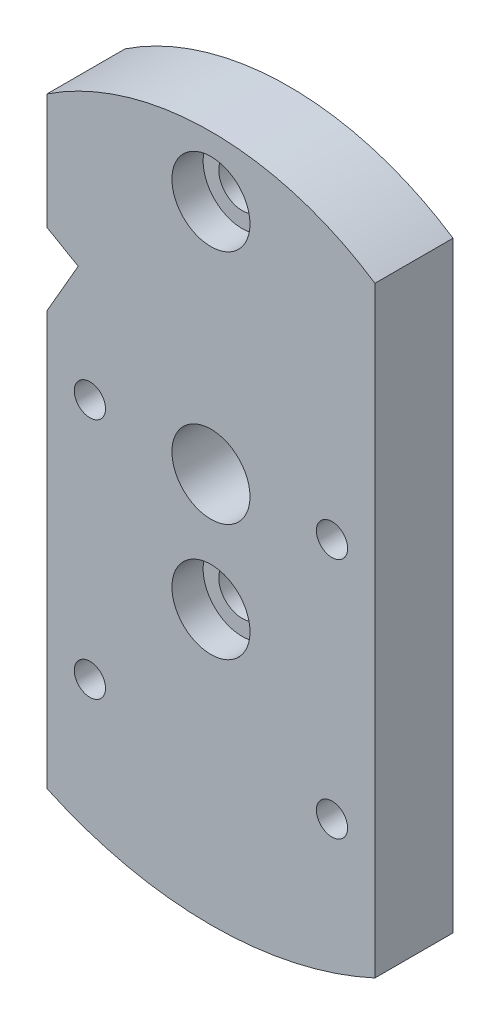
ISO-10303-21;
HEADER;
FILE_DESCRIPTION(('STEP AP214'),'2;1');
FILE_NAME('part.step','',(''),(''),'','','');
FILE_SCHEMA(('AUTOMOTIVE_DESIGN { 1 0 10303 214 1 1 1 1 }'));
ENDSEC;
DATA;
#1=APPLICATION_CONTEXT('core data for automotive mechanical design processes');
#2=APPLICATION_PROTOCOL_DEFINITION('international standard','automotive_design',2000,#1);
#3=PRODUCT_CONTEXT('',#1,'mechanical');
#4=PRODUCT('Part','Part','',(#3));
#5=PRODUCT_RELATED_PRODUCT_CATEGORY('part','',(#4));
#6=PRODUCT_DEFINITION_FORMATION('','',#4);
#7=PRODUCT_DEFINITION_CONTEXT('part definition',#1,'design');
#8=PRODUCT_DEFINITION('design','',#6,#7);
#9=PRODUCT_DEFINITION_SHAPE('','',#8);
#10=(LENGTH_UNIT() NAMED_UNIT(*) SI_UNIT(.MILLI.,.METRE.));
#11=(NAMED_UNIT(*) PLANE_ANGLE_UNIT() SI_UNIT($,.RADIAN.));
#12=(NAMED_UNIT(*) SI_UNIT($,.STERADIAN.) SOLID_ANGLE_UNIT());
#13=UNCERTAINTY_MEASURE_WITH_UNIT(LENGTH_MEASURE(1.E-05),#10,'distance_accuracy_value','');
#14=(GEOMETRIC_REPRESENTATION_CONTEXT(3) GLOBAL_UNCERTAINTY_ASSIGNED_CONTEXT((#13)) GLOBAL_UNIT_ASSIGNED_CONTEXT((#10,
#11,#12)) REPRESENTATION_CONTEXT('',''));
#15=CARTESIAN_POINT('',(0.,0.,0.));
#16=DIRECTION('',(0.,0.,1.));
#17=DIRECTION('',(1.,0.,0.));
#18=AXIS2_PLACEMENT_3D('',#15,#16,#17);
#19=CARTESIAN_POINT('',(-28.1737576182718,-2.22608611624981,0.));
#20=DIRECTION('',(0.866025403784438,-0.500000000000001,0.));
#21=DIRECTION('',(0.500000000000001,0.866025403784438,0.));
#22=AXIS2_PLACEMENT_3D('',#19,#20,#21);
#23=PLANE('',#22);
#24=DIRECTION('',(0.500000000000001,0.866025403784438,0.));
#25=VECTOR('',#24,1.);
#26=CARTESIAN_POINT('',(-28.1737576182718,-2.22608611624981,10.));
#27=LINE('',#26,#25);
#28=CARTESIAN_POINT('',(-28.1737576182718,-2.22608611624981,10.));
#29=VERTEX_POINT('',#28);
#30=CARTESIAN_POINT('',(-24.1737576182718,4.7021171140257,10.));
#31=VERTEX_POINT('',#30);
#32=EDGE_CURVE('E116',#29,#31,#27,.T.);
#33=ORIENTED_EDGE('',*,*,#32,.T.);
#34=DIRECTION('',(0.,0.,1.));
#35=VECTOR('',#34,1.);
#36=CARTESIAN_POINT('',(-24.1737576182718,4.7021171140257,0.));
#37=LINE('',#36,#35);
#38=CARTESIAN_POINT('',(-24.1737576182718,4.7021171140257,0.));
#39=VERTEX_POINT('',#38);
#40=EDGE_CURVE('E112',#39,#31,#37,.T.);
#41=ORIENTED_EDGE('',*,*,#40,.F.);
#42=DIRECTION('',(0.500000000000001,0.866025403784438,0.));
#43=VECTOR('',#42,1.);
#44=CARTESIAN_POINT('',(-28.1737576182718,-2.22608611624981,0.));
#45=LINE('',#44,#43);
#46=CARTESIAN_POINT('',(-28.1737576182717,-2.2260861162498,0.));
#47=VERTEX_POINT('',#46);
#48=EDGE_CURVE('E62',#47,#39,#45,.T.);
#49=ORIENTED_EDGE('',*,*,#48,.F.);
#50=DIRECTION('',(0.,0.,1.));
#51=VECTOR('',#50,1.);
#52=CARTESIAN_POINT('',(-28.1737576182718,-2.22608611624981,0.));
#53=LINE('',#52,#51);
#54=EDGE_CURVE('E120',#47,#29,#53,.T.);
#55=ORIENTED_EDGE('',*,*,#54,.T.);
#56=EDGE_LOOP('',(#33,#41,#49,#55));
#57=FACE_BOUND('',#56,.T.);
#58=CARTESIAN_POINT('',(-26.1737576182718,1.23801549888795,5.));
#59=DIRECTION('',(-0.866025403784438,0.500000000000001,0.));
#60=DIRECTION('',(-0.500000000000001,-0.866025403784438,0.));
#61=AXIS2_PLACEMENT_3D('',#58,#59,#60);
#62=CIRCLE('',#61,2.025);
#63=CARTESIAN_POINT('',(-27.1862576182718,-0.515685943775535,5.));
#64=VERTEX_POINT('',#63);
#65=EDGE_CURVE('E436',#64,#64,#62,.T.);
#66=ORIENTED_EDGE('',*,*,#65,.F.);
#67=EDGE_LOOP('',(#66));
#68=FACE_BOUND('',#67,.T.);
#69=ADVANCED_FACE('F40',(#57,#68),#23,.F.);
#70=CARTESIAN_POINT('',(-28.1737576182717,-45.8530191573034,10.));
#71=DIRECTION('',(1.,0.,0.));
#72=DIRECTION('',(0.,0.,-1.));
#73=AXIS2_PLACEMENT_3D('',#70,#71,#72);
#74=PLANE('',#73);
#75=DIRECTION('',(0.,-1.,0.));
#76=VECTOR('',#75,1.);
#77=CARTESIAN_POINT('',(-28.1737576182717,-45.8530191573034,0.));
#78=LINE('',#77,#76);
#79=CARTESIAN_POINT('',(-28.1737576182718,21.8171560869228,0.));
#80=VERTEX_POINT('',#79);
#81=CARTESIAN_POINT('',(-28.1737576182718,7.01151819078422,0.));
#82=VERTEX_POINT('',#81);
#83=EDGE_CURVE('E220',#80,#82,#78,.T.);
#84=ORIENTED_EDGE('',*,*,#83,.T.);
#85=DIRECTION('',(0.,0.,1.));
#86=VECTOR('',#85,1.);
#87=CARTESIAN_POINT('',(-28.1737576182718,7.01151819078422,0.));
#88=LINE('',#87,#86);
#89=CARTESIAN_POINT('',(-28.1737576182718,7.01151819078422,10.));
#90=VERTEX_POINT('',#89);
#91=EDGE_CURVE('E119',#82,#90,#88,.T.);
#92=ORIENTED_EDGE('',*,*,#91,.T.);
#93=DIRECTION('',(0.,-1.,0.));
#94=VECTOR('',#93,1.);
#95=CARTESIAN_POINT('',(-28.1737576182718,21.8171560869228,10.));
#96=LINE('',#95,#94);
#97=CARTESIAN_POINT('',(-28.1737576182718,21.8171560869228,10.));
#98=VERTEX_POINT('',#97);
#99=EDGE_CURVE('E211',#98,#90,#96,.T.);
#100=ORIENTED_EDGE('',*,*,#99,.F.);
#101=DIRECTION('',(0.,0.,-1.));
#102=VECTOR('',#101,1.);
#103=CARTESIAN_POINT('',(-28.1737576182718,21.8171560869228,10.));
#104=LINE('',#103,#102);
#105=EDGE_CURVE('E54',#98,#80,#104,.T.);
#106=ORIENTED_EDGE('',*,*,#105,.T.);
#107=EDGE_LOOP('',(#84,#92,#100,#106));
#108=FACE_BOUND('',#107,.T.);
#109=ADVANCED_FACE('F285',(#108),#74,.F.);
#110=CARTESIAN_POINT('',(-22.6737576182718,-9.35301915730339,10.));
#111=DIRECTION('',(0.,0.,-1.));
#112=DIRECTION('',(-1.,0.,0.));
#113=AXIS2_PLACEMENT_3D('',#110,#111,#112);
#114=CYLINDRICAL_SURFACE('',#113,2.);
#115=CARTESIAN_POINT('',(-22.6737576182718,-9.35301915730339,10.));
#116=DIRECTION('',(0.,0.,1.));
#117=DIRECTION('',(1.,0.,0.));
#118=AXIS2_PLACEMENT_3D('',#115,#116,#117);
#119=CIRCLE('',#118,2.);
#120=CARTESIAN_POINT('',(-20.6737576182718,-9.35301915730339,10.));
#121=VERTEX_POINT('',#120);
#122=EDGE_CURVE('E194',#121,#121,#119,.T.);
#123=ORIENTED_EDGE('',*,*,#122,.T.);
#124=EDGE_LOOP('',(#123));
#125=FACE_BOUND('',#124,.T.);
#126=CARTESIAN_POINT('',(-22.6737576182718,-9.35301915730339,5.));
#127=DIRECTION('',(0.,0.,-1.));
#128=DIRECTION('',(-1.,0.,0.));
#129=AXIS2_PLACEMENT_3D('',#126,#127,#128);
#130=CIRCLE('',#129,2.);
#131=CARTESIAN_POINT('',(-24.6737576182718,-9.35301915730339,5.));
#132=VERTEX_POINT('',#131);
#133=EDGE_CURVE('E180',#132,#132,#130,.T.);
#134=ORIENTED_EDGE('',*,*,#133,.T.);
#135=EDGE_LOOP('',(#134));
#136=FACE_BOUND('',#135,.T.);
#137=ADVANCED_FACE('F244',(#125,#136),#114,.F.);
#138=CARTESIAN_POINT('',(-22.6737576182718,-40.3530191573034,10.));
#139=DIRECTION('',(0.,0.,-1.));
#140=DIRECTION('',(-1.,0.,0.));
#141=AXIS2_PLACEMENT_3D('',#138,#139,#140);
#142=CYLINDRICAL_SURFACE('',#141,2.);
#143=CARTESIAN_POINT('',(-22.6737576182718,-40.3530191573034,10.));
#144=DIRECTION('',(0.,0.,1.));
#145=DIRECTION('',(1.,0.,0.));
#146=AXIS2_PLACEMENT_3D('',#143,#144,#145);
#147=CIRCLE('',#146,2.);
#148=CARTESIAN_POINT('',(-20.6737576182718,-40.3530191573034,10.));
#149=VERTEX_POINT('',#148);
#150=EDGE_CURVE('E191',#149,#149,#147,.T.);
#151=ORIENTED_EDGE('',*,*,#150,.T.);
#152=EDGE_LOOP('',(#151));
#153=FACE_BOUND('',#152,.T.);
#154=CARTESIAN_POINT('',(-22.6737576182718,-40.3530191573034,5.));
#155=DIRECTION('',(0.,0.,-1.));
#156=DIRECTION('',(-1.,0.,0.));
#157=AXIS2_PLACEMENT_3D('',#154,#155,#156);
#158=CIRCLE('',#157,2.);
#159=CARTESIAN_POINT('',(-24.6737576182718,-40.3530191573034,5.));
#160=VERTEX_POINT('',#159);
#161=EDGE_CURVE('E239',#160,#160,#158,.T.);
#162=ORIENTED_EDGE('',*,*,#161,.T.);
#163=EDGE_LOOP('',(#162));
#164=FACE_BOUND('',#163,.T.);
#165=ADVANCED_FACE('F478',(#153,#164),#142,.F.);
#166=CARTESIAN_POINT('',(8.32624238172824,-40.3530191573034,10.));
#167=DIRECTION('',(0.,0.,-1.));
#168=DIRECTION('',(-1.,0.,0.));
#169=AXIS2_PLACEMENT_3D('',#166,#167,#168);
#170=CYLINDRICAL_SURFACE('',#169,2.);
#171=CARTESIAN_POINT('',(8.32624238172824,-40.3530191573034,10.));
#172=DIRECTION('',(0.,0.,1.));
#173=DIRECTION('',(1.,0.,0.));
#174=AXIS2_PLACEMENT_3D('',#171,#172,#173);
#175=CIRCLE('',#174,2.);
#176=CARTESIAN_POINT('',(10.3262423817282,-40.3530191573034,10.));
#177=VERTEX_POINT('',#176);
#178=EDGE_CURVE('E188',#177,#177,#175,.T.);
#179=ORIENTED_EDGE('',*,*,#178,.T.);
#180=EDGE_LOOP('',(#179));
#181=FACE_BOUND('',#180,.T.);
#182=CARTESIAN_POINT('',(8.32624238172824,-40.3530191573034,5.));
#183=DIRECTION('',(0.,0.,-1.));
#184=DIRECTION('',(-1.,0.,0.));
#185=AXIS2_PLACEMENT_3D('',#182,#183,#184);
#186=CIRCLE('',#185,2.);
#187=CARTESIAN_POINT('',(6.32624238172824,-40.3530191573034,5.));
#188=VERTEX_POINT('',#187);
#189=EDGE_CURVE('E236',#188,#188,#186,.T.);
#190=ORIENTED_EDGE('',*,*,#189,.T.);
#191=EDGE_LOOP('',(#190));
#192=FACE_BOUND('',#191,.T.);
#193=ADVANCED_FACE('F474',(#181,#192),#170,.F.);
#194=CARTESIAN_POINT('',(8.32624238172824,-9.35301915730338,10.));
#195=DIRECTION('',(0.,0.,-1.));
#196=DIRECTION('',(-1.,0.,0.));
#197=AXIS2_PLACEMENT_3D('',#194,#195,#196);
#198=CYLINDRICAL_SURFACE('',#197,2.);
#199=CARTESIAN_POINT('',(8.32624238172824,-9.35301915730338,10.));
#200=DIRECTION('',(0.,0.,1.));
#201=DIRECTION('',(1.,0.,0.));
#202=AXIS2_PLACEMENT_3D('',#199,#200,#201);
#203=CIRCLE('',#202,2.);
#204=CARTESIAN_POINT('',(10.3262423817282,-9.35301915730338,10.));
#205=VERTEX_POINT('',#204);
#206=EDGE_CURVE('E184',#205,#205,#203,.T.);
#207=ORIENTED_EDGE('',*,*,#206,.T.);
#208=EDGE_LOOP('',(#207));
#209=FACE_BOUND('',#208,.T.);
#210=CARTESIAN_POINT('',(8.32624238172824,-9.35301915730338,5.));
#211=DIRECTION('',(0.,0.,-1.));
#212=DIRECTION('',(-1.,0.,0.));
#213=AXIS2_PLACEMENT_3D('',#210,#211,#212);
#214=CIRCLE('',#213,2.);
#215=CARTESIAN_POINT('',(6.32624238172824,-9.35301915730338,5.));
#216=VERTEX_POINT('',#215);
#217=EDGE_CURVE('E164',#216,#216,#214,.T.);
#218=ORIENTED_EDGE('',*,*,#217,.T.);
#219=EDGE_LOOP('',(#218));
#220=FACE_BOUND('',#219,.T.);
#221=ADVANCED_FACE('F477',(#209,#220),#198,.F.);
#222=CARTESIAN_POINT('',(-7.17375761827176,-24.8530191573034,10.));
#223=DIRECTION('',(0.,0.,-1.));
#224=DIRECTION('',(-1.,0.,0.));
#225=AXIS2_PLACEMENT_3D('',#222,#223,#224);
#226=CYLINDRICAL_SURFACE('',#225,3.);
#227=CARTESIAN_POINT('',(-7.17375761827176,-24.8530191573034,0.));
#228=DIRECTION('',(0.,0.,1.));
#229=DIRECTION('',(1.,0.,0.));
#230=AXIS2_PLACEMENT_3D('',#227,#228,#229);
#231=CIRCLE('',#230,3.);
#232=CARTESIAN_POINT('',(-4.17375761827176,-24.8530191573034,0.));
#233=VERTEX_POINT('',#232);
#234=EDGE_CURVE('E201',#233,#233,#231,.T.);
#235=ORIENTED_EDGE('',*,*,#234,.F.);
#236=EDGE_LOOP('',(#235));
#237=FACE_BOUND('',#236,.T.);
#238=CARTESIAN_POINT('',(-7.17375761827176,-24.8530191573034,6.));
#239=DIRECTION('',(0.,0.,1.));
#240=DIRECTION('',(1.,0.,0.));
#241=AXIS2_PLACEMENT_3D('',#238,#239,#240);
#242=CIRCLE('',#241,3.);
#243=CARTESIAN_POINT('',(-4.17375761827176,-24.8530191573034,6.));
#244=VERTEX_POINT('',#243);
#245=EDGE_CURVE('E185',#244,#244,#242,.T.);
#246=ORIENTED_EDGE('',*,*,#245,.T.);
#247=EDGE_LOOP('',(#246));
#248=FACE_BOUND('',#247,.T.);
#249=ADVANCED_FACE('F449',(#237,#248),#226,.F.);
#250=CARTESIAN_POINT('',(-7.17375761827176,20.3769808426966,10.));
#251=DIRECTION('',(0.,0.,-1.));
#252=DIRECTION('',(-1.,0.,0.));
#253=AXIS2_PLACEMENT_3D('',#250,#251,#252);
#254=CYLINDRICAL_SURFACE('',#253,3.);
#255=CARTESIAN_POINT('',(-7.17375761827176,20.3769808426966,0.));
#256=DIRECTION('',(0.,0.,1.));
#257=DIRECTION('',(1.,0.,0.));
#258=AXIS2_PLACEMENT_3D('',#255,#256,#257);
#259=CIRCLE('',#258,3.);
#260=CARTESIAN_POINT('',(-4.17375761827176,20.3769808426966,0.));
#261=VERTEX_POINT('',#260);
#262=EDGE_CURVE('E181',#261,#261,#259,.T.);
#263=ORIENTED_EDGE('',*,*,#262,.F.);
#264=EDGE_LOOP('',(#263));
#265=FACE_BOUND('',#264,.T.);
#266=CARTESIAN_POINT('',(-7.17375761827176,20.3769808426966,6.));
#267=DIRECTION('',(0.,0.,1.));
#268=DIRECTION('',(1.,0.,0.));
#269=AXIS2_PLACEMENT_3D('',#266,#267,#268);
#270=CIRCLE('',#269,3.);
#271=CARTESIAN_POINT('',(-4.17375761827176,20.3769808426966,6.));
#272=VERTEX_POINT('',#271);
#273=EDGE_CURVE('E170',#272,#272,#270,.T.);
#274=ORIENTED_EDGE('',*,*,#273,.T.);
#275=EDGE_LOOP('',(#274));
#276=FACE_BOUND('',#275,.T.);
#277=ADVANCED_FACE('F359',(#265,#276),#254,.F.);
#278=CARTESIAN_POINT('',(-7.17375761827176,-9.85301915730338,10.));
#279=DIRECTION('',(0.,0.,1.));
#280=DIRECTION('',(1.,0.,0.));
#281=AXIS2_PLACEMENT_3D('',#278,#279,#280);
#282=PLANE('',#281);
#283=DIRECTION('',(-0.866025403784438,0.500000000000002,0.));
#284=VECTOR('',#283,1.);
#285=CARTESIAN_POINT('',(-24.1737576182718,4.7021171140257,10.));
#286=LINE('',#285,#284);
#287=EDGE_CURVE('E132',#31,#90,#286,.T.);
#288=ORIENTED_EDGE('',*,*,#287,.F.);
#289=ORIENTED_EDGE('',*,*,#32,.F.);
#290=CARTESIAN_POINT('',(-28.1737576182717,-55.2292243754571,10.));
#291=VERTEX_POINT('',#290);
#292=EDGE_CURVE('E210',#29,#291,#96,.T.);
#293=ORIENTED_EDGE('',*,*,#292,.T.);
#294=CARTESIAN_POINT('',(-7.17375761827176,-9.85301915730338,10.));
#295=DIRECTION('',(0.,0.,1.));
#296=DIRECTION('',(1.,0.,0.));
#297=AXIS2_PLACEMENT_3D('',#294,#295,#296);
#298=CIRCLE('',#297,50.);
#299=CARTESIAN_POINT('',(13.8262423817282,-55.2292243754571,10.));
#300=VERTEX_POINT('',#299);
#301=EDGE_CURVE('E71',#291,#300,#298,.T.);
#302=ORIENTED_EDGE('',*,*,#301,.T.);
#303=DIRECTION('',(0.,1.,0.));
#304=VECTOR('',#303,1.);
#305=CARTESIAN_POINT('',(13.8262423817283,-45.8530191573034,10.));
#306=LINE('',#305,#304);
#307=CARTESIAN_POINT('',(13.8262423817282,21.8171560869228,10.));
#308=VERTEX_POINT('',#307);
#309=EDGE_CURVE('E97',#300,#308,#306,.T.);
#310=ORIENTED_EDGE('',*,*,#309,.T.);
#311=CARTESIAN_POINT('',(-7.17375761827176,-9.85301915730338,10.));
#312=DIRECTION('',(0.,0.,1.));
#313=DIRECTION('',(1.,0.,0.));
#314=AXIS2_PLACEMENT_3D('',#311,#312,#313);
#315=CIRCLE('',#314,38.);
#316=EDGE_CURVE('E206',#308,#98,#315,.T.);
#317=ORIENTED_EDGE('',*,*,#316,.T.);
#318=ORIENTED_EDGE('',*,*,#99,.T.);
#319=EDGE_LOOP('',(#288,#289,#293,#302,#310,#317,#318));
#320=FACE_BOUND('',#319,.T.);
#321=CARTESIAN_POINT('',(-7.17375761827176,-24.8530191573034,10.));
#322=DIRECTION('',(0.,0.,1.));
#323=DIRECTION('',(1.,0.,0.));
#324=AXIS2_PLACEMENT_3D('',#321,#322,#323);
#325=CIRCLE('',#324,5.);
#326=CARTESIAN_POINT('',(-2.17375761827176,-24.8530191573034,10.));
#327=VERTEX_POINT('',#326);
#328=EDGE_CURVE('E171',#327,#327,#325,.T.);
#329=ORIENTED_EDGE('',*,*,#328,.F.);
#330=EDGE_LOOP('',(#329));
#331=FACE_BOUND('',#330,.T.);
#332=CARTESIAN_POINT('',(-7.17375761827176,20.3769808426966,10.));
#333=DIRECTION('',(0.,0.,1.));
#334=DIRECTION('',(1.,0.,0.));
#335=AXIS2_PLACEMENT_3D('',#332,#333,#334);
#336=CIRCLE('',#335,5.);
#337=CARTESIAN_POINT('',(-2.17375761827176,20.3769808426966,10.));
#338=VERTEX_POINT('',#337);
#339=EDGE_CURVE('E177',#338,#338,#336,.T.);
#340=ORIENTED_EDGE('',*,*,#339,.F.);
#341=EDGE_LOOP('',(#340));
#342=FACE_BOUND('',#341,.T.);
#343=ORIENTED_EDGE('',*,*,#206,.F.);
#344=EDGE_LOOP('',(#343));
#345=FACE_BOUND('',#344,.T.);
#346=ORIENTED_EDGE('',*,*,#150,.F.);
#347=EDGE_LOOP('',(#346));
#348=FACE_BOUND('',#347,.T.);
#349=CARTESIAN_POINT('',(-7.17375761827176,-9.85301915730338,10.));
#350=DIRECTION('',(0.,0.,1.));
#351=DIRECTION('',(1.,0.,0.));
#352=AXIS2_PLACEMENT_3D('',#349,#350,#351);
#353=CIRCLE('',#352,5.);
#354=CARTESIAN_POINT('',(-2.17375761827175,-9.85301915730338,10.));
#355=VERTEX_POINT('',#354);
#356=EDGE_CURVE('E198',#355,#355,#353,.T.);
#357=ORIENTED_EDGE('',*,*,#356,.F.);
#358=EDGE_LOOP('',(#357));
#359=FACE_BOUND('',#358,.T.);
#360=ORIENTED_EDGE('',*,*,#122,.F.);
#361=EDGE_LOOP('',(#360));
#362=FACE_BOUND('',#361,.T.);
#363=ORIENTED_EDGE('',*,*,#178,.F.);
#364=EDGE_LOOP('',(#363));
#365=FACE_BOUND('',#364,.T.);
#366=ADVANCED_FACE('F261',(#320,#331,#342,#345,#348,#359,#362,#365),#282,.T.);
#367=CARTESIAN_POINT('',(-7.17375761827176,-9.85301915730338,0.));
#368=DIRECTION('',(0.,0.,1.));
#369=DIRECTION('',(1.,0.,0.));
#370=AXIS2_PLACEMENT_3D('',#367,#368,#369);
#371=PLANE('',#370);
#372=CARTESIAN_POINT('',(8.32624238172824,-40.3530191573034,0.));
#373=DIRECTION('',(0.,0.,-1.));
#374=DIRECTION('',(-1.,0.,0.));
#375=AXIS2_PLACEMENT_3D('',#372,#373,#374);
#376=CIRCLE('',#375,3.);
#377=CARTESIAN_POINT('',(5.32624238172824,-40.3530191573034,0.));
#378=VERTEX_POINT('',#377);
#379=EDGE_CURVE('E153',#378,#378,#376,.T.);
#380=ORIENTED_EDGE('',*,*,#379,.F.);
#381=EDGE_LOOP('',(#380));
#382=FACE_BOUND('',#381,.T.);
#383=CARTESIAN_POINT('',(-22.6737576182718,-9.35301915730339,0.));
#384=DIRECTION('',(0.,0.,-1.));
#385=DIRECTION('',(-1.,0.,0.));
#386=AXIS2_PLACEMENT_3D('',#383,#384,#385);
#387=CIRCLE('',#386,3.);
#388=CARTESIAN_POINT('',(-25.6737576182718,-9.35301915730339,0.));
#389=VERTEX_POINT('',#388);
#390=EDGE_CURVE('E146',#389,#389,#387,.T.);
#391=ORIENTED_EDGE('',*,*,#390,.F.);
#392=EDGE_LOOP('',(#391));
#393=FACE_BOUND('',#392,.T.);
#394=CARTESIAN_POINT('',(8.34724916826394,-9.37405445250766,0.));
#395=DIRECTION('',(0.,0.,-1.));
#396=DIRECTION('',(-1.,0.,0.));
#397=AXIS2_PLACEMENT_3D('',#394,#395,#396);
#398=CIRCLE('',#397,3.);
#399=CARTESIAN_POINT('',(5.34724916826394,-9.37405445250766,0.));
#400=VERTEX_POINT('',#399);
#401=EDGE_CURVE('E140',#400,#400,#398,.T.);
#402=ORIENTED_EDGE('',*,*,#401,.F.);
#403=EDGE_LOOP('',(#402));
#404=FACE_BOUND('',#403,.T.);
#405=CARTESIAN_POINT('',(-22.6947644048075,-40.3319838620991,0.));
#406=DIRECTION('',(0.,0.,-1.));
#407=DIRECTION('',(-1.,0.,0.));
#408=AXIS2_PLACEMENT_3D('',#405,#406,#407);
#409=CIRCLE('',#408,3.);
#410=CARTESIAN_POINT('',(-25.6947644048075,-40.3319838620991,0.));
#411=VERTEX_POINT('',#410);
#412=EDGE_CURVE('E152',#411,#411,#409,.T.);
#413=ORIENTED_EDGE('',*,*,#412,.F.);
#414=EDGE_LOOP('',(#413));
#415=FACE_BOUND('',#414,.T.);
#416=ORIENTED_EDGE('',*,*,#48,.T.);
#417=DIRECTION('',(-0.866025403784438,0.500000000000002,0.));
#418=VECTOR('',#417,1.);
#419=CARTESIAN_POINT('',(-24.1737576182718,4.7021171140257,0.));
#420=LINE('',#419,#418);
#421=EDGE_CURVE('E123',#39,#82,#420,.T.);
#422=ORIENTED_EDGE('',*,*,#421,.T.);
#423=ORIENTED_EDGE('',*,*,#83,.F.);
#424=CARTESIAN_POINT('',(-7.17375761827176,-9.85301915730338,0.));
#425=DIRECTION('',(0.,0.,1.));
#426=DIRECTION('',(1.,0.,0.));
#427=AXIS2_PLACEMENT_3D('',#424,#425,#426);
#428=CIRCLE('',#427,38.);
#429=CARTESIAN_POINT('',(13.8262423817282,21.8171560869228,0.));
#430=VERTEX_POINT('',#429);
#431=EDGE_CURVE('E217',#430,#80,#428,.T.);
#432=ORIENTED_EDGE('',*,*,#431,.F.);
#433=DIRECTION('',(0.,1.,0.));
#434=VECTOR('',#433,1.);
#435=CARTESIAN_POINT('',(13.8262423817282,21.8171560869228,0.));
#436=LINE('',#435,#434);
#437=CARTESIAN_POINT('',(13.8262423817282,-55.2292243754571,0.));
#438=VERTEX_POINT('',#437);
#439=EDGE_CURVE('E92',#438,#430,#436,.T.);
#440=ORIENTED_EDGE('',*,*,#439,.F.);
#441=CARTESIAN_POINT('',(-7.17375761827176,-9.85301915730338,0.));
#442=DIRECTION('',(0.,0.,1.));
#443=DIRECTION('',(1.,0.,0.));
#444=AXIS2_PLACEMENT_3D('',#441,#442,#443);
#445=CIRCLE('',#444,50.);
#446=CARTESIAN_POINT('',(-28.1737576182717,-55.2292243754571,0.));
#447=VERTEX_POINT('',#446);
#448=EDGE_CURVE('E207',#447,#438,#445,.T.);
#449=ORIENTED_EDGE('',*,*,#448,.F.);
#450=EDGE_CURVE('E131',#47,#447,#78,.T.);
#451=ORIENTED_EDGE('',*,*,#450,.F.);
#452=EDGE_LOOP('',(#416,#422,#423,#432,#440,#449,#451));
#453=FACE_BOUND('',#452,.T.);
#454=ORIENTED_EDGE('',*,*,#234,.T.);
#455=EDGE_LOOP('',(#454));
#456=FACE_BOUND('',#455,.T.);
#457=CARTESIAN_POINT('',(-7.17375761827176,-9.85301915730338,0.));
#458=DIRECTION('',(0.,0.,1.));
#459=DIRECTION('',(1.,0.,0.));
#460=AXIS2_PLACEMENT_3D('',#457,#458,#459);
#461=CIRCLE('',#460,5.);
#462=CARTESIAN_POINT('',(-2.17375761827175,-9.85301915730338,0.));
#463=VERTEX_POINT('',#462);
#464=EDGE_CURVE('E197',#463,#463,#461,.T.);
#465=ORIENTED_EDGE('',*,*,#464,.T.);
#466=EDGE_LOOP('',(#465));
#467=FACE_BOUND('',#466,.T.);
#468=ORIENTED_EDGE('',*,*,#262,.T.);
#469=EDGE_LOOP('',(#468));
#470=FACE_BOUND('',#469,.T.);
#471=ADVANCED_FACE('F129',(#382,#393,#404,#415,#453,#456,#467,#470),#371,.F.);
#472=CARTESIAN_POINT('',(13.8262423817282,21.8171560869228,10.));
#473=DIRECTION('',(-1.,0.,0.));
#474=DIRECTION('',(0.,-1.,0.));
#475=AXIS2_PLACEMENT_3D('',#472,#473,#474);
#476=PLANE('',#475);
#477=ORIENTED_EDGE('',*,*,#439,.T.);
#478=DIRECTION('',(0.,0.,-1.));
#479=VECTOR('',#478,1.);
#480=CARTESIAN_POINT('',(13.8262423817282,21.8171560869228,10.));
#481=LINE('',#480,#479);
#482=EDGE_CURVE('E12',#308,#430,#481,.T.);
#483=ORIENTED_EDGE('',*,*,#482,.F.);
#484=ORIENTED_EDGE('',*,*,#309,.F.);
#485=DIRECTION('',(0.,0.,-1.));
#486=VECTOR('',#485,1.);
#487=CARTESIAN_POINT('',(13.8262423817282,-55.2292243754571,10.));
#488=LINE('',#487,#486);
#489=EDGE_CURVE('E215',#300,#438,#488,.T.);
#490=ORIENTED_EDGE('',*,*,#489,.T.);
#491=EDGE_LOOP('',(#477,#483,#484,#490));
#492=FACE_BOUND('',#491,.T.);
#493=ADVANCED_FACE('F42',(#492),#476,.F.);
#494=CARTESIAN_POINT('',(-7.17375761827176,-9.85301915730338,10.));
#495=DIRECTION('',(0.,0.,-1.));
#496=DIRECTION('',(-1.,0.,0.));
#497=AXIS2_PLACEMENT_3D('',#494,#495,#496);
#498=CYLINDRICAL_SURFACE('',#497,38.);
#499=ORIENTED_EDGE('',*,*,#431,.T.);
#500=ORIENTED_EDGE('',*,*,#105,.F.);
#501=ORIENTED_EDGE('',*,*,#316,.F.);
#502=ORIENTED_EDGE('',*,*,#482,.T.);
#503=EDGE_LOOP('',(#499,#500,#501,#502));
#504=FACE_BOUND('',#503,.T.);
#505=ADVANCED_FACE('F378',(#504),#498,.T.);
#506=ORIENTED_EDGE('',*,*,#292,.F.);
#507=ORIENTED_EDGE('',*,*,#54,.F.);
#508=ORIENTED_EDGE('',*,*,#450,.T.);
#509=DIRECTION('',(0.,0.,-1.));
#510=VECTOR('',#509,1.);
#511=CARTESIAN_POINT('',(-28.1737576182717,-55.2292243754571,10.));
#512=LINE('',#511,#510);
#513=EDGE_CURVE('E225',#291,#447,#512,.T.);
#514=ORIENTED_EDGE('',*,*,#513,.F.);
#515=EDGE_LOOP('',(#506,#507,#508,#514));
#516=FACE_BOUND('',#515,.T.);
#517=ADVANCED_FACE('F292',(#516),#74,.F.);
#518=CARTESIAN_POINT('',(-7.17375761827176,-9.85301915730338,10.));
#519=DIRECTION('',(0.,0.,-1.));
#520=DIRECTION('',(-1.,0.,0.));
#521=AXIS2_PLACEMENT_3D('',#518,#519,#520);
#522=CYLINDRICAL_SURFACE('',#521,50.);
#523=ORIENTED_EDGE('',*,*,#448,.T.);
#524=ORIENTED_EDGE('',*,*,#489,.F.);
#525=ORIENTED_EDGE('',*,*,#301,.F.);
#526=ORIENTED_EDGE('',*,*,#513,.T.);
#527=EDGE_LOOP('',(#523,#524,#525,#526));
#528=FACE_BOUND('',#527,.T.);
#529=ADVANCED_FACE('F377',(#528),#522,.T.);
#530=CARTESIAN_POINT('',(-7.17375761827176,-9.85301915730338,10.));
#531=DIRECTION('',(0.,0.,-1.));
#532=DIRECTION('',(-1.,0.,0.));
#533=AXIS2_PLACEMENT_3D('',#530,#531,#532);
#534=CYLINDRICAL_SURFACE('',#533,5.);
#535=CARTESIAN_POINT('',(-12.0644512969022,-8.81325219215945,5.));
#536=CARTESIAN_POINT('',(-12.0644513065098,-8.81325238610352,4.90966308920579));
#537=CARTESIAN_POINT('',(-12.0628405803897,-8.80558761089778,4.81932689055772));
#538=CARTESIAN_POINT('',(-12.056260289748,-8.77533560011448,4.64131430780565));
#539=CARTESIAN_POINT('',(-12.0512901681877,-8.75274588977052,4.55363836733242));
#540=CARTESIAN_POINT('',(-12.0376187259668,-8.6938124760112,4.38353943488579));
#541=CARTESIAN_POINT('',(-12.0289238179094,-8.65749242336616,4.30110769332991));
#542=CARTESIAN_POINT('',(-12.0072474690403,-8.57267353263113,4.14338602690045));
#543=CARTESIAN_POINT('',(-11.9942651708695,-8.52417225909997,4.06809753435803));
#544=CARTESIAN_POINT('',(-11.9629017147118,-8.41517169844123,3.92424969147864));
#545=CARTESIAN_POINT('',(-11.9443666792375,-8.35434906273277,3.85596879338702));
#546=CARTESIAN_POINT('',(-11.90140459484,-8.2238893471403,3.73057778146908));
#547=CARTESIAN_POINT('',(-11.8769768513166,-8.15425122859567,3.67346898598724));
#548=CARTESIAN_POINT('',(-11.8212183768519,-8.00710296246161,3.57100689601976));
#549=CARTESIAN_POINT('',(-11.7897646086302,-7.92946777502127,3.52589920293589));
#550=CARTESIAN_POINT('',(-11.7201099679659,-7.77017922893694,3.45037768361603));
#551=CARTESIAN_POINT('',(-11.6819109634569,-7.68852698722543,3.41995979807288));
#552=CARTESIAN_POINT('',(-11.6006441597644,-7.52695760572523,3.3757039155129));
#553=CARTESIAN_POINT('',(-11.5577942331468,-7.4470801159464,3.36132159965337));
#554=CARTESIAN_POINT('',(-11.4671672781029,-7.28885496505328,3.34776505452273));
#555=CARTESIAN_POINT('',(-11.4193913170494,-7.2105069768842,3.34858753753402));
#556=CARTESIAN_POINT('',(-11.3220584400171,-7.06028783243306,3.36506261055409));
#557=CARTESIAN_POINT('',(-11.2726149243915,-6.98828759835792,3.38021710514093));
#558=CARTESIAN_POINT('',(-11.1721820641086,-6.84969923120843,3.42405725539852));
#559=CARTESIAN_POINT('',(-11.121192574725,-6.7831116069971,3.45274418159116));
#560=CARTESIAN_POINT('',(-11.0185630368418,-6.65547168016548,3.52337533090626));
#561=CARTESIAN_POINT('',(-10.9669290228192,-6.59454851090265,3.56556097220444));
#562=CARTESIAN_POINT('',(-10.8660183781396,-6.48062972994874,3.66179756903204));
#563=CARTESIAN_POINT('',(-10.8167424568119,-6.42763649356228,3.71585206780285));
#564=CARTESIAN_POINT('',(-10.7203109240924,-6.32782252310202,3.83740153955853));
#565=CARTESIAN_POINT('',(-10.6733761840911,-6.28142929349009,3.90542374212648));
#566=CARTESIAN_POINT('',(-10.5867360394903,-6.19854488512368,4.05140794309778));
#567=CARTESIAN_POINT('',(-10.5470316453538,-6.16205509005568,4.12937132822732));
#568=CARTESIAN_POINT('',(-10.476790632168,-6.09905711854822,4.29418179493688));
#569=CARTESIAN_POINT('',(-10.4463527898438,-6.07265577059662,4.38111220684608));
#570=CARTESIAN_POINT('',(-10.3973209117643,-6.03075633833442,4.56074305210521));
#571=CARTESIAN_POINT('',(-10.3787211419281,-6.01525297491837,4.65344066803581));
#572=CARTESIAN_POINT('',(-10.3554254440183,-5.99592078260763,4.83681848838016));
#573=CARTESIAN_POINT('',(-10.350058791254,-5.99152846460036,4.92735420283326));
#574=CARTESIAN_POINT('',(-10.3516697896737,-5.99285375992775,5.10823117726869));
#575=CARTESIAN_POINT('',(-10.3586450867486,-5.99856944525719,5.19857247104421));
#576=CARTESIAN_POINT('',(-10.3839269588262,-6.01960508697975,5.37302313500979));
#577=CARTESIAN_POINT('',(-10.4018058076503,-6.03456277488514,5.45723944972855));
#578=CARTESIAN_POINT('',(-10.4473485644083,-6.07353578224709,5.62078074215298));
#579=CARTESIAN_POINT('',(-10.4750142911924,-6.09755278539424,5.70010480743453));
#580=CARTESIAN_POINT('',(-10.5396657665249,-6.15537107970457,5.8547057907506));
#581=CARTESIAN_POINT('',(-10.5769457773322,-6.18948754284284,5.9297413405947));
#582=CARTESIAN_POINT('',(-10.6583131184081,-6.26679303220621,6.07093299424252));
#583=CARTESIAN_POINT('',(-10.7024026235124,-6.30998495857311,6.13708624853036));
#584=CARTESIAN_POINT('',(-10.7978569293494,-6.40761570723165,6.26234596404967));
#585=CARTESIAN_POINT('',(-10.8494865413173,-6.46253725342932,6.32087610163762));
#586=CARTESIAN_POINT('',(-10.9555996947491,-6.58132162893819,6.42483323275512));
#587=CARTESIAN_POINT('',(-11.0100832412659,-6.64518447408061,6.47026020308412));
#588=CARTESIAN_POINT('',(-11.1193592270952,-6.78059837972557,6.54647005681245));
#589=CARTESIAN_POINT('',(-11.1741505177129,-6.85212932806175,6.57729015258671));
#590=CARTESIAN_POINT('',(-11.2818593485419,-7.00136126335237,6.6232767934776));
#591=CARTESIAN_POINT('',(-11.334777579345,-7.07905994128722,6.63844916716122));
#592=CARTESIAN_POINT('',(-11.4342359260694,-7.23454041354188,6.6521461948592));
#593=CARTESIAN_POINT('',(-11.4809606341171,-7.31213704113048,6.65143931763613));
#594=CARTESIAN_POINT('',(-11.5694924298446,-7.4685715207826,6.63523675946427));
#595=CARTESIAN_POINT('',(-11.6113000650255,-7.54740923354454,6.61974272677484));
#596=CARTESIAN_POINT('',(-11.688305472002,-7.7021638633643,6.57498602070884));
#597=CARTESIAN_POINT('',(-11.7236242042003,-7.77810730099452,6.54602107771615));
#598=CARTESIAN_POINT('',(-11.7884078979361,-7.92647744976357,6.47535552928115));
#599=CARTESIAN_POINT('',(-11.8178719390679,-7.99890360660672,6.43365292398371));
#600=CARTESIAN_POINT('',(-11.8718862153956,-8.14027289003447,6.33716626019805));
#601=CARTESIAN_POINT('',(-11.8962498747293,-8.20903139416802,6.28200758190302));
#602=CARTESIAN_POINT('',(-11.9392777501519,-8.33826968475165,6.16081708109601));
#603=CARTESIAN_POINT('',(-11.957940276981,-8.39874701454584,6.09478204479528));
#604=CARTESIAN_POINT('',(-11.9907847730201,-8.51144162887585,5.95074279073262));
#605=CARTESIAN_POINT('',(-12.0047700527478,-8.5632588364454,5.87237971252087));
#606=CARTESIAN_POINT('',(-12.0279841628625,-8.65357359655129,5.70767812042595));
#607=CARTESIAN_POINT('',(-12.0372140941994,-8.69207423143808,5.62134145803638));
#608=CARTESIAN_POINT('',(-12.0512529581696,-8.75257974671106,5.44697027728887));
#609=CARTESIAN_POINT('',(-12.0562375004723,-8.77523210655769,5.35917492954944));
#610=CARTESIAN_POINT('',(-12.0628361806889,-8.80556608084905,5.1809189674477));
#611=CARTESIAN_POINT('',(-12.0644512872815,-8.81325199795299,5.09045912668667));
#612=CARTESIAN_POINT('',(-12.0644512969022,-8.81325219215945,5.));
#613=B_SPLINE_CURVE_WITH_KNOTS('',3,(#535,#536,#537,#538,#539,#540,#541,#542,#543,#544,#545,
#546,#547,#548,#549,#550,#551,#552,#553,#554,#555,#556,#557,#558,#559,#560,#561,#562,#563,#564,
#565,#566,#567,#568,#569,#570,#571,#572,#573,#574,#575,#576,#577,#578,#579,#580,#581,#582,#583,
#584,#585,#586,#587,#588,#589,#590,#591,#592,#593,#594,#595,#596,#597,#598,#599,#600,#601,#602,
#603,#604,#605,#606,#607,#608,#609,#610,#611,#612),.UNSPECIFIED.,.T.,.F.,(4,2,2,2,2,2,2,2,2,2,2,
2,2,2,2,2,2,2,2,2,2,2,2,2,2,2,2,2,2,2,2,2,2,2,2,2,2,2,4),(0.,0.270677608953613,
0.541400111369971,0.811658398469126,1.08197076248416,1.36060334815203,1.63926879356531,
1.92326149682601,2.20717567801007,2.48112761830498,2.75502032295408,3.01973092785974,
3.28446639064666,3.55422933628866,3.82407292473545,4.10708692905983,4.3901404551569,
4.67611329881576,4.96194751839403,5.23296566047313,5.50393211400188,5.76489751761616,
6.02591144605164,6.2961299367598,6.56643490977998,6.85139142020679,7.13634843517673,
7.42057554055472,7.7046967368617,7.97509900804129,8.24547114218559,8.5101325386326,
8.77483550917242,9.04797636904806,9.32119808292295,9.60477811184593,9.88829245728355,
10.1594142187583,10.43045802471),.UNSPECIFIED.);
#614=CARTESIAN_POINT('',(-12.0644512969022,-8.81325219215945,5.));
#615=VERTEX_POINT('',#614);
#616=EDGE_CURVE('E44',#615,#615,#613,.T.);
#617=ORIENTED_EDGE('',*,*,#616,.F.);
#618=EDGE_LOOP('',(#617));
#619=FACE_BOUND('',#618,.T.);
#620=ORIENTED_EDGE('',*,*,#356,.T.);
#621=EDGE_LOOP('',(#620));
#622=FACE_BOUND('',#621,.T.);
#623=ORIENTED_EDGE('',*,*,#464,.F.);
#624=EDGE_LOOP('',(#623));
#625=FACE_BOUND('',#624,.T.);
#626=ADVANCED_FACE('F399',(#619,#622,#625),#534,.F.);
#627=CARTESIAN_POINT('',(-7.17375761827176,20.3769808426966,6.));
#628=DIRECTION('',(0.,0.,1.));
#629=DIRECTION('',(1.,0.,0.));
#630=AXIS2_PLACEMENT_3D('',#627,#628,#629);
#631=CYLINDRICAL_SURFACE('',#630,5.);
#632=CARTESIAN_POINT('',(-7.17375761827176,20.3769808426966,6.));
#633=DIRECTION('',(0.,0.,1.));
#634=DIRECTION('',(1.,0.,0.));
#635=AXIS2_PLACEMENT_3D('',#632,#633,#634);
#636=CIRCLE('',#635,5.);
#637=CARTESIAN_POINT('',(-2.17375761827176,20.3769808426966,6.));
#638=VERTEX_POINT('',#637);
#639=EDGE_CURVE('E174',#638,#638,#636,.T.);
#640=ORIENTED_EDGE('',*,*,#639,.F.);
#641=EDGE_LOOP('',(#640));
#642=FACE_BOUND('',#641,.T.);
#643=ORIENTED_EDGE('',*,*,#339,.T.);
#644=EDGE_LOOP('',(#643));
#645=FACE_BOUND('',#644,.T.);
#646=ADVANCED_FACE('F404',(#642,#645),#631,.F.);
#647=CARTESIAN_POINT('',(-7.17375761827176,20.3769808426966,6.));
#648=DIRECTION('',(0.,0.,1.));
#649=DIRECTION('',(1.,0.,0.));
#650=AXIS2_PLACEMENT_3D('',#647,#648,#649);
#651=PLANE('',#650);
#652=ORIENTED_EDGE('',*,*,#273,.F.);
#653=EDGE_LOOP('',(#652));
#654=FACE_BOUND('',#653,.T.);
#655=ORIENTED_EDGE('',*,*,#639,.T.);
#656=EDGE_LOOP('',(#655));
#657=FACE_BOUND('',#656,.T.);
#658=ADVANCED_FACE('F453',(#654,#657),#651,.T.);
#659=CARTESIAN_POINT('',(-7.17375761827176,-24.8530191573034,6.));
#660=DIRECTION('',(0.,0.,1.));
#661=DIRECTION('',(1.,0.,0.));
#662=AXIS2_PLACEMENT_3D('',#659,#660,#661);
#663=CYLINDRICAL_SURFACE('',#662,5.);
#664=CARTESIAN_POINT('',(-7.17375761827176,-24.8530191573034,6.));
#665=DIRECTION('',(0.,0.,1.));
#666=DIRECTION('',(1.,0.,0.));
#667=AXIS2_PLACEMENT_3D('',#664,#665,#666);
#668=CIRCLE('',#667,5.);
#669=CARTESIAN_POINT('',(-2.17375761827176,-24.8530191573034,6.));
#670=VERTEX_POINT('',#669);
#671=EDGE_CURVE('E167',#670,#670,#668,.T.);
#672=ORIENTED_EDGE('',*,*,#671,.F.);
#673=EDGE_LOOP('',(#672));
#674=FACE_BOUND('',#673,.T.);
#675=ORIENTED_EDGE('',*,*,#328,.T.);
#676=EDGE_LOOP('',(#675));
#677=FACE_BOUND('',#676,.T.);
#678=ADVANCED_FACE('F456',(#674,#677),#663,.F.);
#679=CARTESIAN_POINT('',(-7.17375761827176,-24.8530191573034,6.));
#680=DIRECTION('',(0.,0.,1.));
#681=DIRECTION('',(1.,0.,0.));
#682=AXIS2_PLACEMENT_3D('',#679,#680,#681);
#683=PLANE('',#682);
#684=ORIENTED_EDGE('',*,*,#245,.F.);
#685=EDGE_LOOP('',(#684));
#686=FACE_BOUND('',#685,.T.);
#687=ORIENTED_EDGE('',*,*,#671,.T.);
#688=EDGE_LOOP('',(#687));
#689=FACE_BOUND('',#688,.T.);
#690=ADVANCED_FACE('F301',(#686,#689),#683,.T.);
#691=CARTESIAN_POINT('',(8.34724916826394,-9.37405445250766,5.));
#692=DIRECTION('',(0.,0.,-1.));
#693=DIRECTION('',(-1.,0.,0.));
#694=AXIS2_PLACEMENT_3D('',#691,#692,#693);
#695=CYLINDRICAL_SURFACE('',#694,3.);
#696=CARTESIAN_POINT('',(8.34724916826394,-9.37405445250766,5.));
#697=DIRECTION('',(0.,0.,-1.));
#698=DIRECTION('',(-1.,0.,0.));
#699=AXIS2_PLACEMENT_3D('',#696,#697,#698);
#700=CIRCLE('',#699,3.);
#701=CARTESIAN_POINT('',(5.34724916826394,-9.37405445250766,5.));
#702=VERTEX_POINT('',#701);
#703=EDGE_CURVE('E143',#702,#702,#700,.T.);
#704=ORIENTED_EDGE('',*,*,#703,.F.);
#705=EDGE_LOOP('',(#704));
#706=FACE_BOUND('',#705,.T.);
#707=ORIENTED_EDGE('',*,*,#401,.T.);
#708=EDGE_LOOP('',(#707));
#709=FACE_BOUND('',#708,.T.);
#710=ADVANCED_FACE('F298',(#706,#709),#695,.F.);
#711=CARTESIAN_POINT('',(8.34724916826394,-9.37405445250766,5.));
#712=DIRECTION('',(0.,0.,-1.));
#713=DIRECTION('',(-1.,0.,0.));
#714=AXIS2_PLACEMENT_3D('',#711,#712,#713);
#715=PLANE('',#714);
#716=ORIENTED_EDGE('',*,*,#217,.F.);
#717=EDGE_LOOP('',(#716));
#718=FACE_BOUND('',#717,.T.);
#719=ORIENTED_EDGE('',*,*,#703,.T.);
#720=EDGE_LOOP('',(#719));
#721=FACE_BOUND('',#720,.T.);
#722=ADVANCED_FACE('F295',(#718,#721),#715,.T.);
#723=CARTESIAN_POINT('',(8.32624238172824,-40.3530191573034,5.));
#724=DIRECTION('',(0.,0.,-1.));
#725=DIRECTION('',(-1.,0.,0.));
#726=AXIS2_PLACEMENT_3D('',#723,#724,#725);
#727=CYLINDRICAL_SURFACE('',#726,3.);
#728=CARTESIAN_POINT('',(8.32624238172824,-40.3530191573034,5.));
#729=DIRECTION('',(0.,0.,-1.));
#730=DIRECTION('',(-1.,0.,0.));
#731=AXIS2_PLACEMENT_3D('',#728,#729,#730);
#732=CIRCLE('',#731,3.);
#733=CARTESIAN_POINT('',(5.32624238172824,-40.3530191573034,5.));
#734=VERTEX_POINT('',#733);
#735=EDGE_CURVE('E149',#734,#734,#732,.T.);
#736=ORIENTED_EDGE('',*,*,#735,.F.);
#737=EDGE_LOOP('',(#736));
#738=FACE_BOUND('',#737,.T.);
#739=ORIENTED_EDGE('',*,*,#379,.T.);
#740=EDGE_LOOP('',(#739));
#741=FACE_BOUND('',#740,.T.);
#742=ADVANCED_FACE('F279',(#738,#741),#727,.F.);
#743=CARTESIAN_POINT('',(8.32624238172824,-40.3530191573034,5.));
#744=DIRECTION('',(0.,0.,-1.));
#745=DIRECTION('',(-1.,0.,0.));
#746=AXIS2_PLACEMENT_3D('',#743,#744,#745);
#747=PLANE('',#746);
#748=ORIENTED_EDGE('',*,*,#189,.F.);
#749=EDGE_LOOP('',(#748));
#750=FACE_BOUND('',#749,.T.);
#751=ORIENTED_EDGE('',*,*,#735,.T.);
#752=EDGE_LOOP('',(#751));
#753=FACE_BOUND('',#752,.T.);
#754=ADVANCED_FACE('F270',(#750,#753),#747,.T.);
#755=CARTESIAN_POINT('',(-22.6947644048075,-40.3319838620991,5.));
#756=DIRECTION('',(0.,0.,-1.));
#757=DIRECTION('',(-1.,0.,0.));
#758=AXIS2_PLACEMENT_3D('',#755,#756,#757);
#759=CYLINDRICAL_SURFACE('',#758,3.);
#760=CARTESIAN_POINT('',(-22.6947644048075,-40.3319838620991,5.));
#761=DIRECTION('',(0.,0.,-1.));
#762=DIRECTION('',(-1.,0.,0.));
#763=AXIS2_PLACEMENT_3D('',#760,#761,#762);
#764=CIRCLE('',#763,3.);
#765=CARTESIAN_POINT('',(-25.6947644048075,-40.3319838620991,5.));
#766=VERTEX_POINT('',#765);
#767=EDGE_CURVE('E161',#766,#766,#764,.T.);
#768=ORIENTED_EDGE('',*,*,#767,.F.);
#769=EDGE_LOOP('',(#768));
#770=FACE_BOUND('',#769,.T.);
#771=ORIENTED_EDGE('',*,*,#412,.T.);
#772=EDGE_LOOP('',(#771));
#773=FACE_BOUND('',#772,.T.);
#774=ADVANCED_FACE('F268',(#770,#773),#759,.F.);
#775=CARTESIAN_POINT('',(-22.6947644048075,-40.3319838620991,5.));
#776=DIRECTION('',(0.,0.,-1.));
#777=DIRECTION('',(-1.,0.,0.));
#778=AXIS2_PLACEMENT_3D('',#775,#776,#777);
#779=PLANE('',#778);
#780=ORIENTED_EDGE('',*,*,#161,.F.);
#781=EDGE_LOOP('',(#780));
#782=FACE_BOUND('',#781,.T.);
#783=ORIENTED_EDGE('',*,*,#767,.T.);
#784=EDGE_LOOP('',(#783));
#785=FACE_BOUND('',#784,.T.);
#786=ADVANCED_FACE('F255',(#782,#785),#779,.T.);
#787=CARTESIAN_POINT('',(-22.6737576182718,-9.35301915730339,5.));
#788=DIRECTION('',(0.,0.,-1.));
#789=DIRECTION('',(-1.,0.,0.));
#790=AXIS2_PLACEMENT_3D('',#787,#788,#789);
#791=CYLINDRICAL_SURFACE('',#790,3.);
#792=CARTESIAN_POINT('',(-22.6737576182718,-9.35301915730339,5.));
#793=DIRECTION('',(0.,0.,-1.));
#794=DIRECTION('',(-1.,0.,0.));
#795=AXIS2_PLACEMENT_3D('',#792,#793,#794);
#796=CIRCLE('',#795,3.);
#797=CARTESIAN_POINT('',(-25.6737576182718,-9.35301915730339,5.));
#798=VERTEX_POINT('',#797);
#799=EDGE_CURVE('E156',#798,#798,#796,.T.);
#800=ORIENTED_EDGE('',*,*,#799,.F.);
#801=EDGE_LOOP('',(#800));
#802=FACE_BOUND('',#801,.T.);
#803=ORIENTED_EDGE('',*,*,#390,.T.);
#804=EDGE_LOOP('',(#803));
#805=FACE_BOUND('',#804,.T.);
#806=ADVANCED_FACE('F249',(#802,#805),#791,.F.);
#807=CARTESIAN_POINT('',(-22.6737576182718,-9.35301915730339,5.));
#808=DIRECTION('',(0.,0.,-1.));
#809=DIRECTION('',(-1.,0.,0.));
#810=AXIS2_PLACEMENT_3D('',#807,#808,#809);
#811=PLANE('',#810);
#812=ORIENTED_EDGE('',*,*,#133,.F.);
#813=EDGE_LOOP('',(#812));
#814=FACE_BOUND('',#813,.T.);
#815=ORIENTED_EDGE('',*,*,#799,.T.);
#816=EDGE_LOOP('',(#815));
#817=FACE_BOUND('',#816,.T.);
#818=ADVANCED_FACE('F246',(#814,#817),#811,.T.);
#819=CARTESIAN_POINT('',(-24.1737576182718,4.7021171140257,0.));
#820=DIRECTION('',(0.500000000000002,0.866025403784438,0.));
#821=DIRECTION('',(-0.866025403784438,0.500000000000002,0.));
#822=AXIS2_PLACEMENT_3D('',#819,#820,#821);
#823=PLANE('',#822);
#824=ORIENTED_EDGE('',*,*,#287,.T.);
#825=ORIENTED_EDGE('',*,*,#91,.F.);
#826=ORIENTED_EDGE('',*,*,#421,.F.);
#827=ORIENTED_EDGE('',*,*,#40,.T.);
#828=EDGE_LOOP('',(#824,#825,#826,#827));
#829=FACE_BOUND('',#828,.T.);
#830=ADVANCED_FACE('F124',(#829),#823,.F.);
#831=CARTESIAN_POINT('',(-26.1737576182718,1.23801549888795,5.));
#832=DIRECTION('',(-0.866025403784438,0.500000000000001,0.));
#833=DIRECTION('',(-0.500000000000001,-0.866025403784438,0.));
#834=AXIS2_PLACEMENT_3D('',#831,#832,#833);
#835=CYLINDRICAL_SURFACE('',#834,1.65);
#836=ORIENTED_EDGE('',*,*,#616,.T.);
#837=EDGE_LOOP('',(#836));
#838=FACE_BOUND('',#837,.T.);
#839=CARTESIAN_POINT('',(-25.8489980918526,1.05051549888795,5.));
#840=DIRECTION('',(-0.866025403784438,0.500000000000001,0.));
#841=DIRECTION('',(-0.500000000000001,-0.866025403784438,0.));
#842=AXIS2_PLACEMENT_3D('',#839,#840,#841);
#843=CIRCLE('',#842,1.65);
#844=CARTESIAN_POINT('',(-26.6739980918526,-0.378426417356372,5.));
#845=VERTEX_POINT('',#844);
#846=EDGE_CURVE('E136',#845,#845,#843,.T.);
#847=ORIENTED_EDGE('',*,*,#846,.T.);
#848=EDGE_LOOP('',(#847));
#849=FACE_BOUND('',#848,.T.);
#850=ADVANCED_FACE('F388',(#838,#849),#835,.F.);
#851=CARTESIAN_POINT('',(-26.1737576182718,1.23801549888795,5.));
#852=DIRECTION('',(-0.866025403784438,0.500000000000001,0.));
#853=DIRECTION('',(-0.500000000000001,-0.866025403784438,0.));
#854=AXIS2_PLACEMENT_3D('',#851,#852,#853);
#855=CONICAL_SURFACE('',#854,2.025,0.785398163397447);
#856=CARTESIAN_POINT('',(-26.6739980918526,-0.378426417356372,5.));
#857=CARTESIAN_POINT('',(-26.6793341285861,-0.379856204089905,5.));
#858=CARTESIAN_POINT('',(-26.6846701653197,-0.381285990823438,5.));
#859=CARTESIAN_POINT('',(-26.6953422387867,-0.384145564290503,5.));
#860=CARTESIAN_POINT('',(-26.7006782755203,-0.385575351024036,5.));
#861=CARTESIAN_POINT('',(-26.7113503489873,-0.388434924491102,5.));
#862=CARTESIAN_POINT('',(-26.7166863857209,-0.389864711224635,5.));
#863=CARTESIAN_POINT('',(-26.7273584591879,-0.392724284691701,5.));
#864=CARTESIAN_POINT('',(-26.7326944959214,-0.394154071425234,5.));
#865=CARTESIAN_POINT('',(-26.7433665693885,-0.3970136448923,5.));
#866=CARTESIAN_POINT('',(-26.748702606122,-0.398443431625833,5.));
#867=CARTESIAN_POINT('',(-26.7593746795891,-0.401303005092899,5.));
#868=CARTESIAN_POINT('',(-26.7647107163226,-0.402732791826432,5.));
#869=CARTESIAN_POINT('',(-26.7753827897897,-0.405592365293498,5.));
#870=CARTESIAN_POINT('',(-26.7807188265232,-0.407022152027031,5.));
#871=CARTESIAN_POINT('',(-26.7913908999903,-0.409881725494097,5.));
#872=CARTESIAN_POINT('',(-26.7967269367238,-0.41131151222763,5.));
#873=CARTESIAN_POINT('',(-26.8073990101909,-0.414171085694696,5.));
#874=CARTESIAN_POINT('',(-26.8127350469244,-0.415600872428229,5.));
#875=CARTESIAN_POINT('',(-26.8234071203915,-0.418460445895294,5.));
#876=CARTESIAN_POINT('',(-26.828743157125,-0.419890232628827,5.));
#877=CARTESIAN_POINT('',(-26.8394152305921,-0.422749806095893,5.));
#878=CARTESIAN_POINT('',(-26.8447512673256,-0.424179592829426,5.));
#879=CARTESIAN_POINT('',(-26.8554233407927,-0.427039166296492,5.));
#880=CARTESIAN_POINT('',(-26.8607593775262,-0.428468953030025,5.));
#881=CARTESIAN_POINT('',(-26.8714314509933,-0.431328526497091,5.));
#882=CARTESIAN_POINT('',(-26.8767674877268,-0.432758313230624,5.));
#883=CARTESIAN_POINT('',(-26.8874395611939,-0.43561788669769,5.));
#884=CARTESIAN_POINT('',(-26.8927755979274,-0.437047673431223,5.));
#885=CARTESIAN_POINT('',(-26.9034476713945,-0.439907246898289,5.));
#886=CARTESIAN_POINT('',(-26.908783708128,-0.441337033631822,5.));
#887=CARTESIAN_POINT('',(-26.9194557815951,-0.444196607098888,5.));
#888=CARTESIAN_POINT('',(-26.9247918183286,-0.44562639383242,5.));
#889=CARTESIAN_POINT('',(-26.9354638917957,-0.448485967299486,5.));
#890=CARTESIAN_POINT('',(-26.9407999285292,-0.44991575403302,5.));
#891=CARTESIAN_POINT('',(-26.9514720019963,-0.452775327500086,5.));
#892=CARTESIAN_POINT('',(-26.9568080387298,-0.454205114233618,5.));
#893=CARTESIAN_POINT('',(-26.9674801121969,-0.457064687700684,5.));
#894=CARTESIAN_POINT('',(-26.9728161489304,-0.458494474434217,5.));
#895=CARTESIAN_POINT('',(-26.9834882223975,-0.461354047901283,5.));
#896=CARTESIAN_POINT('',(-26.988824259131,-0.462783834634816,5.));
#897=CARTESIAN_POINT('',(-26.9994963325981,-0.465643408101882,5.));
#898=CARTESIAN_POINT('',(-27.0048323693316,-0.467073194835415,5.));
#899=CARTESIAN_POINT('',(-27.0155044427987,-0.469932768302481,5.));
#900=CARTESIAN_POINT('',(-27.0208404795322,-0.471362555036014,5.));
#901=CARTESIAN_POINT('',(-27.0315125529993,-0.47422212850308,5.));
#902=CARTESIAN_POINT('',(-27.0368485897328,-0.475651915236613,5.));
#903=CARTESIAN_POINT('',(-27.0475206631999,-0.478511488703679,5.));
#904=CARTESIAN_POINT('',(-27.0528566999334,-0.479941275437212,5.));
#905=CARTESIAN_POINT('',(-27.0635287734005,-0.482800848904277,5.));
#906=CARTESIAN_POINT('',(-27.068864810134,-0.48423063563781,5.));
#907=CARTESIAN_POINT('',(-27.0795368836011,-0.487090209104876,5.));
#908=CARTESIAN_POINT('',(-27.0848729203346,-0.488519995838409,5.));
#909=CARTESIAN_POINT('',(-27.0955449938017,-0.491379569305475,5.));
#910=CARTESIAN_POINT('',(-27.1008810305352,-0.492809356039008,5.));
#911=CARTESIAN_POINT('',(-27.1115531040023,-0.495668929506074,5.));
#912=CARTESIAN_POINT('',(-27.1168891407358,-0.497098716239607,5.));
#913=CARTESIAN_POINT('',(-27.1275612142029,-0.499958289706673,5.));
#914=CARTESIAN_POINT('',(-27.1328972509364,-0.501388076440206,5.));
#915=CARTESIAN_POINT('',(-27.1435693244035,-0.504247649907272,5.));
#916=CARTESIAN_POINT('',(-27.148905361137,-0.505677436640805,5.));
#917=CARTESIAN_POINT('',(-27.1595774346041,-0.508537010107871,5.));
#918=CARTESIAN_POINT('',(-27.1649134713376,-0.509966796841404,5.));
#919=CARTESIAN_POINT('',(-27.1755855448047,-0.512826370308469,5.));
#920=CARTESIAN_POINT('',(-27.1809215815382,-0.514256157042002,5.));
#921=CARTESIAN_POINT('',(-27.1862576182718,-0.515685943775536,5.));
#922=B_SPLINE_CURVE_WITH_KNOTS('',3,(#856,#857,#858,#859,#860,#861,#862,#863,#864,#865,#866,
#867,#868,#869,#870,#871,#872,#873,#874,#875,#876,#877,#878,#879,#880,#881,#882,#883,#884,#885,
#886,#887,#888,#889,#890,#891,#892,#893,#894,#895,#896,#897,#898,#899,#900,#901,#902,#903,#904,
#905,#906,#907,#908,#909,#910,#911,#912,#913,#914,#915,#916,#917,#918,#919,#920,#921),
.UNSPECIFIED.,.F.,.F.,(4,2,2,2,2,2,2,2,2,2,2,2,2,2,2,2,2,2,2,2,2,2,2,2,2,2,2,2,2,2,2,2,4),(0.,
0.0165728151840608,0.0331456303681216,0.0497184455521791,0.0662912607362399,0.0828640759203007,
0.0994368911043614,0.116009706288419,0.13258252147248,0.149155336656541,0.165728151840601,
0.182300967024659,0.19887378220872,0.21544659739278,0.232019412576841,0.248592227760899,
0.265165042944959,0.281737858129017,0.298310673313078,0.314883488497135,0.331456303681196,
0.348029118865257,0.364601934049318,0.381174749233375,0.397747564417436,0.414320379601497,
0.430893194785554,0.447466009969615,0.464038825153676,0.480611640337737,0.497184455521794,
0.513757270705855,0.530330085889916),.UNSPECIFIED.);
#923=EDGE_CURVE('BSEAM414',#845,#64,#922,.T.);
#924=ORIENTED_EDGE('',*,*,#846,.F.);
#925=ORIENTED_EDGE('',*,*,#65,.T.);
#926=ORIENTED_EDGE('',*,*,#923,.T.);
#927=ORIENTED_EDGE('',*,*,#923,.F.);
#928=EDGE_LOOP('',(#924,#926,#925,#927));
#929=FACE_BOUND('',#928,.T.);
#930=ADVANCED_FACE('F414',(#929),#855,.F.);
#931=CLOSED_SHELL('',(#69,#109,#137,#165,#193,#221,#249,#277,#366,#471,#493,#505,#517,#529,#626,
#646,#658,#678,#690,#710,#722,#742,#754,#774,#786,#806,#818,#830,#850,#930));
#932=MANIFOLD_SOLID_BREP('B2',#931);
#933=ADVANCED_BREP_SHAPE_REPRESENTATION('',(#18,#932),#14);
#934=SHAPE_DEFINITION_REPRESENTATION(#9,#933);
ENDSEC;
END-ISO-10303-21;
